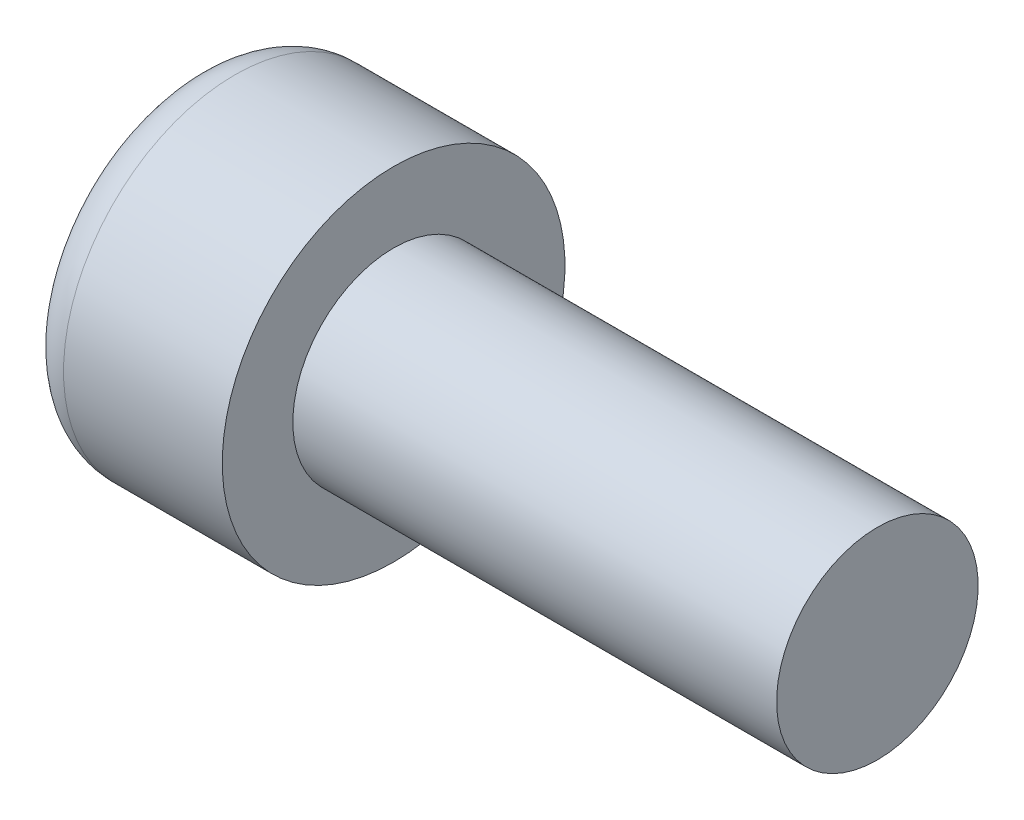
ISO-10303-21;
HEADER;
FILE_DESCRIPTION(('STEP AP214'),'2;1');
FILE_NAME('part.step','',(''),(''),'','','');
FILE_SCHEMA(('AUTOMOTIVE_DESIGN { 1 0 10303 214 1 1 1 1 }'));
ENDSEC;
DATA;
#1=APPLICATION_CONTEXT('core data for automotive mechanical design processes');
#2=APPLICATION_PROTOCOL_DEFINITION('international standard','automotive_design',2000,#1);
#3=PRODUCT_CONTEXT('',#1,'mechanical');
#4=PRODUCT('Part','Part','',(#3));
#5=PRODUCT_RELATED_PRODUCT_CATEGORY('part','',(#4));
#6=PRODUCT_DEFINITION_FORMATION('','',#4);
#7=PRODUCT_DEFINITION_CONTEXT('part definition',#1,'design');
#8=PRODUCT_DEFINITION('design','',#6,#7);
#9=PRODUCT_DEFINITION_SHAPE('','',#8);
#10=(LENGTH_UNIT() NAMED_UNIT(*) SI_UNIT(.MILLI.,.METRE.));
#11=(NAMED_UNIT(*) PLANE_ANGLE_UNIT() SI_UNIT($,.RADIAN.));
#12=(NAMED_UNIT(*) SI_UNIT($,.STERADIAN.) SOLID_ANGLE_UNIT());
#13=UNCERTAINTY_MEASURE_WITH_UNIT(LENGTH_MEASURE(1.E-05),#10,'distance_accuracy_value','');
#14=(GEOMETRIC_REPRESENTATION_CONTEXT(3) GLOBAL_UNCERTAINTY_ASSIGNED_CONTEXT((#13)) GLOBAL_UNIT_ASSIGNED_CONTEXT((#10,
#11,#12)) REPRESENTATION_CONTEXT('',''));
#15=CARTESIAN_POINT('',(0.,0.,0.));
#16=DIRECTION('',(0.,0.,1.));
#17=DIRECTION('',(1.,0.,0.));
#18=AXIS2_PLACEMENT_3D('',#15,#16,#17);
#19=CARTESIAN_POINT('',(0.,0.,0.));
#20=DIRECTION('',(1.,0.,0.));
#21=DIRECTION('',(0.,1.,0.));
#22=AXIS2_PLACEMENT_3D('',#19,#20,#21);
#23=PLANE('',#22);
#24=DIRECTION('',(0.,-0.5,-0.866025403784439));
#25=VECTOR('',#24,1.);
#26=CARTESIAN_POINT('',(0.,2.3094010767585,0.));
#27=LINE('',#26,#25);
#28=CARTESIAN_POINT('',(0.,2.3094010767585,0.));
#29=VERTEX_POINT('',#28);
#30=CARTESIAN_POINT('',(0.,1.15470053837925,-2.));
#31=VERTEX_POINT('',#30);
#32=EDGE_CURVE('E121',#29,#31,#27,.T.);
#33=ORIENTED_EDGE('',*,*,#32,.F.);
#34=DIRECTION('',(0.,0.5,-0.866025403784439));
#35=VECTOR('',#34,1.);
#36=CARTESIAN_POINT('',(0.,1.15470053837925,2.));
#37=LINE('',#36,#35);
#38=CARTESIAN_POINT('',(0.,1.15470053837925,2.));
#39=VERTEX_POINT('',#38);
#40=EDGE_CURVE('E47',#39,#29,#37,.T.);
#41=ORIENTED_EDGE('',*,*,#40,.F.);
#42=DIRECTION('',(0.,1.,0.));
#43=VECTOR('',#42,1.);
#44=CARTESIAN_POINT('',(0.,-1.15470053837925,2.));
#45=LINE('',#44,#43);
#46=CARTESIAN_POINT('',(0.,-1.15470053837925,2.));
#47=VERTEX_POINT('',#46);
#48=EDGE_CURVE('E130',#47,#39,#45,.T.);
#49=ORIENTED_EDGE('',*,*,#48,.F.);
#50=DIRECTION('',(0.,0.5,0.866025403784439));
#51=VECTOR('',#50,1.);
#52=CARTESIAN_POINT('',(0.,-2.3094010767585,0.));
#53=LINE('',#52,#51);
#54=CARTESIAN_POINT('',(0.,-2.3094010767585,0.));
#55=VERTEX_POINT('',#54);
#56=EDGE_CURVE('E128',#55,#47,#53,.T.);
#57=ORIENTED_EDGE('',*,*,#56,.F.);
#58=DIRECTION('',(0.,-0.5,0.866025403784439));
#59=VECTOR('',#58,1.);
#60=CARTESIAN_POINT('',(0.,-1.15470053837925,-2.));
#61=LINE('',#60,#59);
#62=CARTESIAN_POINT('',(0.,-1.15470053837925,-2.));
#63=VERTEX_POINT('',#62);
#64=EDGE_CURVE('E95',#63,#55,#61,.T.);
#65=ORIENTED_EDGE('',*,*,#64,.F.);
#66=DIRECTION('',(0.,-1.,0.));
#67=VECTOR('',#66,1.);
#68=CARTESIAN_POINT('',(0.,1.15470053837925,-2.));
#69=LINE('',#68,#67);
#70=EDGE_CURVE('E124',#31,#63,#69,.T.);
#71=ORIENTED_EDGE('',*,*,#70,.F.);
#72=EDGE_LOOP('',(#33,#41,#49,#57,#65,#71));
#73=FACE_BOUND('',#72,.T.);
#74=CARTESIAN_POINT('',(0.,0.,0.));
#75=DIRECTION('',(-1.,0.,0.));
#76=DIRECTION('',(0.,-1.,0.));
#77=AXIS2_PLACEMENT_3D('',#74,#75,#76);
#78=CIRCLE('',#77,3.1875);
#79=CARTESIAN_POINT('',(0.,-3.1875,0.));
#80=VERTEX_POINT('',#79);
#81=EDGE_CURVE('E11',#80,#80,#78,.T.);
#82=ORIENTED_EDGE('',*,*,#81,.T.);
#83=EDGE_LOOP('',(#82));
#84=FACE_BOUND('',#83,.T.);
#85=ADVANCED_FACE('F33',(#73,#84),#23,.F.);
#86=CARTESIAN_POINT('',(1.0625,0.,0.));
#87=DIRECTION('',(-1.,0.,0.));
#88=DIRECTION('',(0.,-1.,0.));
#89=AXIS2_PLACEMENT_3D('',#86,#87,#88);
#90=TOROIDAL_SURFACE('',#89,3.1875,1.0625);
#91=ORIENTED_EDGE('',*,*,#81,.F.);
#92=EDGE_LOOP('',(#91));
#93=FACE_BOUND('',#92,.T.);
#94=CARTESIAN_POINT('',(1.0625,0.,0.));
#95=DIRECTION('',(-1.,0.,0.));
#96=DIRECTION('',(0.,-1.,0.));
#97=AXIS2_PLACEMENT_3D('',#94,#95,#96);
#98=CIRCLE('',#97,4.25);
#99=CARTESIAN_POINT('',(1.0625,-4.25,0.));
#100=VERTEX_POINT('',#99);
#101=EDGE_CURVE('E40',#100,#100,#98,.T.);
#102=ORIENTED_EDGE('',*,*,#101,.T.);
#103=EDGE_LOOP('',(#102));
#104=FACE_BOUND('',#103,.T.);
#105=ADVANCED_FACE('F150',(#93,#104),#90,.T.);
#106=CARTESIAN_POINT('',(0.,0.,0.));
#107=DIRECTION('',(-1.,0.,0.));
#108=DIRECTION('',(0.,-1.,0.));
#109=AXIS2_PLACEMENT_3D('',#106,#107,#108);
#110=CYLINDRICAL_SURFACE('',#109,4.25);
#111=ORIENTED_EDGE('',*,*,#101,.F.);
#112=EDGE_LOOP('',(#111));
#113=FACE_BOUND('',#112,.T.);
#114=CARTESIAN_POINT('',(5.,0.,0.));
#115=DIRECTION('',(-1.,0.,0.));
#116=DIRECTION('',(0.,-1.,0.));
#117=AXIS2_PLACEMENT_3D('',#114,#115,#116);
#118=CIRCLE('',#117,4.25);
#119=CARTESIAN_POINT('',(5.,-4.25,0.));
#120=VERTEX_POINT('',#119);
#121=EDGE_CURVE('E145',#120,#120,#118,.T.);
#122=ORIENTED_EDGE('',*,*,#121,.T.);
#123=EDGE_LOOP('',(#122));
#124=FACE_BOUND('',#123,.T.);
#125=ADVANCED_FACE('F152',(#113,#124),#110,.T.);
#126=CARTESIAN_POINT('',(5.,4.25,0.));
#127=DIRECTION('',(-1.,0.,0.));
#128=DIRECTION('',(0.,-1.,0.));
#129=AXIS2_PLACEMENT_3D('',#126,#127,#128);
#130=PLANE('',#129);
#131=ORIENTED_EDGE('',*,*,#121,.F.);
#132=EDGE_LOOP('',(#131));
#133=FACE_BOUND('',#132,.T.);
#134=CARTESIAN_POINT('',(5.,0.,0.));
#135=DIRECTION('',(-1.,0.,0.));
#136=DIRECTION('',(0.,-1.,0.));
#137=AXIS2_PLACEMENT_3D('',#134,#135,#136);
#138=CIRCLE('',#137,2.5);
#139=CARTESIAN_POINT('',(5.,-2.5,0.));
#140=VERTEX_POINT('',#139);
#141=EDGE_CURVE('E142',#140,#140,#138,.T.);
#142=ORIENTED_EDGE('',*,*,#141,.T.);
#143=EDGE_LOOP('',(#142));
#144=FACE_BOUND('',#143,.T.);
#145=ADVANCED_FACE('F155',(#133,#144),#130,.F.);
#146=CARTESIAN_POINT('',(0.,0.,0.));
#147=DIRECTION('',(-1.,0.,0.));
#148=DIRECTION('',(0.,-1.,0.));
#149=AXIS2_PLACEMENT_3D('',#146,#147,#148);
#150=CYLINDRICAL_SURFACE('',#149,2.5);
#151=ORIENTED_EDGE('',*,*,#141,.F.);
#152=EDGE_LOOP('',(#151));
#153=FACE_BOUND('',#152,.T.);
#154=CARTESIAN_POINT('',(17.,0.,0.));
#155=DIRECTION('',(-1.,0.,0.));
#156=DIRECTION('',(0.,-1.,0.));
#157=AXIS2_PLACEMENT_3D('',#154,#155,#156);
#158=CIRCLE('',#157,2.5);
#159=CARTESIAN_POINT('',(17.,-2.49999999999999,0.));
#160=VERTEX_POINT('',#159);
#161=EDGE_CURVE('E134',#160,#160,#158,.T.);
#162=ORIENTED_EDGE('',*,*,#161,.T.);
#163=EDGE_LOOP('',(#162));
#164=FACE_BOUND('',#163,.T.);
#165=ADVANCED_FACE('F161',(#153,#164),#150,.T.);
#166=CARTESIAN_POINT('',(17.,2.5,0.));
#167=DIRECTION('',(-1.,0.,0.));
#168=DIRECTION('',(0.,-1.,0.));
#169=AXIS2_PLACEMENT_3D('',#166,#167,#168);
#170=PLANE('',#169);
#171=ORIENTED_EDGE('',*,*,#161,.F.);
#172=EDGE_LOOP('',(#171));
#173=FACE_BOUND('',#172,.T.);
#174=ADVANCED_FACE('F167',(#173),#170,.F.);
#175=CARTESIAN_POINT('',(2.5,1.15470053837925,2.));
#176=DIRECTION('',(0.,0.866025403784439,0.5));
#177=DIRECTION('',(0.,-0.5,0.866025403784439));
#178=AXIS2_PLACEMENT_3D('',#175,#176,#177);
#179=PLANE('',#178);
#180=ORIENTED_EDGE('',*,*,#40,.T.);
#181=DIRECTION('',(-1.,0.,0.));
#182=VECTOR('',#181,1.);
#183=CARTESIAN_POINT('',(2.5,2.3094010767585,0.));
#184=LINE('',#183,#182);
#185=CARTESIAN_POINT('',(2.5,2.3094010767585,0.));
#186=VERTEX_POINT('',#185);
#187=EDGE_CURVE('E77',#186,#29,#184,.T.);
#188=ORIENTED_EDGE('',*,*,#187,.F.);
#189=DIRECTION('',(0.,0.5,-0.866025403784439));
#190=VECTOR('',#189,1.);
#191=CARTESIAN_POINT('',(2.5,1.15470053837925,2.));
#192=LINE('',#191,#190);
#193=CARTESIAN_POINT('',(2.5,1.15470053837925,2.));
#194=VERTEX_POINT('',#193);
#195=EDGE_CURVE('E132',#194,#186,#192,.T.);
#196=ORIENTED_EDGE('',*,*,#195,.F.);
#197=DIRECTION('',(-1.,0.,0.));
#198=VECTOR('',#197,1.);
#199=CARTESIAN_POINT('',(2.5,1.15470053837925,2.));
#200=LINE('',#199,#198);
#201=EDGE_CURVE('E55',#194,#39,#200,.T.);
#202=ORIENTED_EDGE('',*,*,#201,.T.);
#203=EDGE_LOOP('',(#180,#188,#196,#202));
#204=FACE_BOUND('',#203,.T.);
#205=ADVANCED_FACE('F172',(#204),#179,.F.);
#206=CARTESIAN_POINT('',(2.5,-1.15470053837925,2.));
#207=DIRECTION('',(0.,0.,1.));
#208=DIRECTION('',(1.,0.,0.));
#209=AXIS2_PLACEMENT_3D('',#206,#207,#208);
#210=PLANE('',#209);
#211=ORIENTED_EDGE('',*,*,#48,.T.);
#212=ORIENTED_EDGE('',*,*,#201,.F.);
#213=DIRECTION('',(0.,1.,0.));
#214=VECTOR('',#213,1.);
#215=CARTESIAN_POINT('',(2.5,-1.15470053837925,2.));
#216=LINE('',#215,#214);
#217=CARTESIAN_POINT('',(2.5,-1.15470053837925,2.));
#218=VERTEX_POINT('',#217);
#219=EDGE_CURVE('E107',#218,#194,#216,.T.);
#220=ORIENTED_EDGE('',*,*,#219,.F.);
#221=DIRECTION('',(-1.,0.,0.));
#222=VECTOR('',#221,1.);
#223=CARTESIAN_POINT('',(2.5,-1.15470053837925,2.));
#224=LINE('',#223,#222);
#225=EDGE_CURVE('E99',#218,#47,#224,.T.);
#226=ORIENTED_EDGE('',*,*,#225,.T.);
#227=EDGE_LOOP('',(#211,#212,#220,#226));
#228=FACE_BOUND('',#227,.T.);
#229=ADVANCED_FACE('F177',(#228),#210,.F.);
#230=CARTESIAN_POINT('',(2.5,-2.3094010767585,0.));
#231=DIRECTION('',(0.,-0.866025403784439,0.5));
#232=DIRECTION('',(0.,-0.5,-0.866025403784439));
#233=AXIS2_PLACEMENT_3D('',#230,#231,#232);
#234=PLANE('',#233);
#235=ORIENTED_EDGE('',*,*,#56,.T.);
#236=ORIENTED_EDGE('',*,*,#225,.F.);
#237=DIRECTION('',(0.,0.5,0.866025403784439));
#238=VECTOR('',#237,1.);
#239=CARTESIAN_POINT('',(2.5,-2.3094010767585,0.));
#240=LINE('',#239,#238);
#241=CARTESIAN_POINT('',(2.5,-2.3094010767585,0.));
#242=VERTEX_POINT('',#241);
#243=EDGE_CURVE('E103',#242,#218,#240,.T.);
#244=ORIENTED_EDGE('',*,*,#243,.F.);
#245=DIRECTION('',(-1.,0.,0.));
#246=VECTOR('',#245,1.);
#247=CARTESIAN_POINT('',(2.5,-2.3094010767585,0.));
#248=LINE('',#247,#246);
#249=EDGE_CURVE('E88',#242,#55,#248,.T.);
#250=ORIENTED_EDGE('',*,*,#249,.T.);
#251=EDGE_LOOP('',(#235,#236,#244,#250));
#252=FACE_BOUND('',#251,.T.);
#253=ADVANCED_FACE('F104',(#252),#234,.F.);
#254=CARTESIAN_POINT('',(2.5,-1.15470053837925,-2.));
#255=DIRECTION('',(0.,-0.866025403784438,-0.5));
#256=DIRECTION('',(0.,0.5,-0.866025403784438));
#257=AXIS2_PLACEMENT_3D('',#254,#255,#256);
#258=PLANE('',#257);
#259=ORIENTED_EDGE('',*,*,#64,.T.);
#260=ORIENTED_EDGE('',*,*,#249,.F.);
#261=DIRECTION('',(0.,-0.5,0.866025403784439));
#262=VECTOR('',#261,1.);
#263=CARTESIAN_POINT('',(2.5,-1.15470053837925,-2.));
#264=LINE('',#263,#262);
#265=CARTESIAN_POINT('',(2.5,-1.15470053837925,-2.));
#266=VERTEX_POINT('',#265);
#267=EDGE_CURVE('E92',#266,#242,#264,.T.);
#268=ORIENTED_EDGE('',*,*,#267,.F.);
#269=DIRECTION('',(-1.,0.,0.));
#270=VECTOR('',#269,1.);
#271=CARTESIAN_POINT('',(2.5,-1.15470053837925,-2.));
#272=LINE('',#271,#270);
#273=EDGE_CURVE('E100',#266,#63,#272,.T.);
#274=ORIENTED_EDGE('',*,*,#273,.T.);
#275=EDGE_LOOP('',(#259,#260,#268,#274));
#276=FACE_BOUND('',#275,.T.);
#277=ADVANCED_FACE('F90',(#276),#258,.F.);
#278=CARTESIAN_POINT('',(2.5,1.15470053837925,-2.));
#279=DIRECTION('',(0.,0.,-1.));
#280=DIRECTION('',(-1.,0.,0.));
#281=AXIS2_PLACEMENT_3D('',#278,#279,#280);
#282=PLANE('',#281);
#283=ORIENTED_EDGE('',*,*,#70,.T.);
#284=ORIENTED_EDGE('',*,*,#273,.F.);
#285=DIRECTION('',(0.,-1.,0.));
#286=VECTOR('',#285,1.);
#287=CARTESIAN_POINT('',(2.5,1.15470053837925,-2.));
#288=LINE('',#287,#286);
#289=CARTESIAN_POINT('',(2.5,1.15470053837925,-2.));
#290=VERTEX_POINT('',#289);
#291=EDGE_CURVE('E113',#290,#266,#288,.T.);
#292=ORIENTED_EDGE('',*,*,#291,.F.);
#293=DIRECTION('',(-1.,0.,0.));
#294=VECTOR('',#293,1.);
#295=CARTESIAN_POINT('',(2.5,1.15470053837925,-2.));
#296=LINE('',#295,#294);
#297=EDGE_CURVE('E137',#290,#31,#296,.T.);
#298=ORIENTED_EDGE('',*,*,#297,.T.);
#299=EDGE_LOOP('',(#283,#284,#292,#298));
#300=FACE_BOUND('',#299,.T.);
#301=ADVANCED_FACE('F203',(#300),#282,.F.);
#302=CARTESIAN_POINT('',(2.5,2.3094010767585,0.));
#303=DIRECTION('',(0.,0.866025403784439,-0.5));
#304=DIRECTION('',(0.,0.5,0.866025403784439));
#305=AXIS2_PLACEMENT_3D('',#302,#303,#304);
#306=PLANE('',#305);
#307=ORIENTED_EDGE('',*,*,#32,.T.);
#308=ORIENTED_EDGE('',*,*,#297,.F.);
#309=DIRECTION('',(0.,-0.5,-0.866025403784439));
#310=VECTOR('',#309,1.);
#311=CARTESIAN_POINT('',(2.5,2.3094010767585,0.));
#312=LINE('',#311,#310);
#313=EDGE_CURVE('E115',#186,#290,#312,.T.);
#314=ORIENTED_EDGE('',*,*,#313,.F.);
#315=ORIENTED_EDGE('',*,*,#187,.T.);
#316=EDGE_LOOP('',(#307,#308,#314,#315));
#317=FACE_BOUND('',#316,.T.);
#318=ADVANCED_FACE('F191',(#317),#306,.F.);
#319=CARTESIAN_POINT('',(2.5,0.,0.));
#320=DIRECTION('',(-1.,0.,0.));
#321=DIRECTION('',(0.,-1.,0.));
#322=AXIS2_PLACEMENT_3D('',#319,#320,#321);
#323=PLANE('',#322);
#324=ORIENTED_EDGE('',*,*,#195,.T.);
#325=ORIENTED_EDGE('',*,*,#313,.T.);
#326=ORIENTED_EDGE('',*,*,#291,.T.);
#327=ORIENTED_EDGE('',*,*,#267,.T.);
#328=ORIENTED_EDGE('',*,*,#243,.T.);
#329=ORIENTED_EDGE('',*,*,#219,.T.);
#330=EDGE_LOOP('',(#324,#325,#326,#327,#328,#329));
#331=FACE_BOUND('',#330,.T.);
#332=ADVANCED_FACE('F110',(#331),#323,.T.);
#333=CLOSED_SHELL('',(#85,#105,#125,#145,#165,#174,#205,#229,#253,#277,#301,#318,#332));
#334=MANIFOLD_SOLID_BREP('B2',#333);
#335=ADVANCED_BREP_SHAPE_REPRESENTATION('',(#18,#334),#14);
#336=SHAPE_DEFINITION_REPRESENTATION(#9,#335);
ENDSEC;
END-ISO-10303-21;
